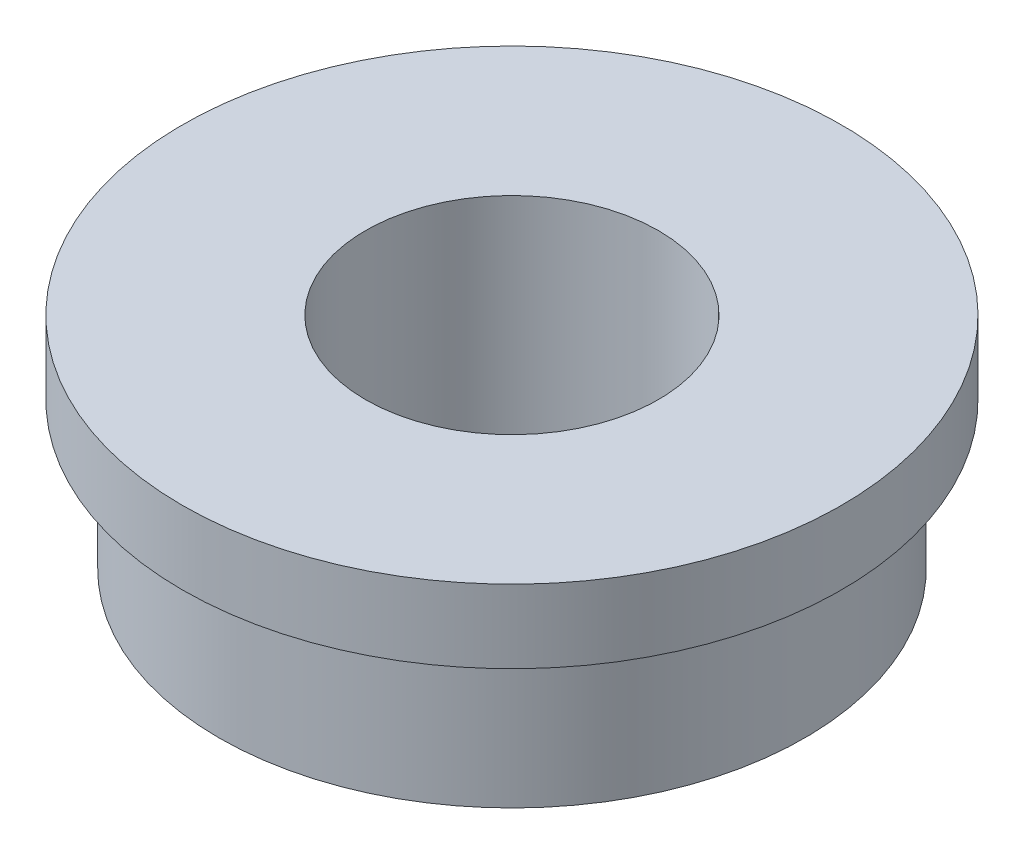
ISO-10303-21;
HEADER;
FILE_DESCRIPTION(('STEP AP214'),'2;1');
FILE_NAME('part.step','',(''),(''),'','','');
FILE_SCHEMA(('AUTOMOTIVE_DESIGN { 1 0 10303 214 1 1 1 1 }'));
ENDSEC;
DATA;
#1=APPLICATION_CONTEXT('core data for automotive mechanical design processes');
#2=APPLICATION_PROTOCOL_DEFINITION('international standard','automotive_design',2000,#1);
#3=PRODUCT_CONTEXT('',#1,'mechanical');
#4=PRODUCT('Part','Part','',(#3));
#5=PRODUCT_RELATED_PRODUCT_CATEGORY('part','',(#4));
#6=PRODUCT_DEFINITION_FORMATION('','',#4);
#7=PRODUCT_DEFINITION_CONTEXT('part definition',#1,'design');
#8=PRODUCT_DEFINITION('design','',#6,#7);
#9=PRODUCT_DEFINITION_SHAPE('','',#8);
#10=(LENGTH_UNIT() NAMED_UNIT(*) SI_UNIT(.MILLI.,.METRE.));
#11=(NAMED_UNIT(*) PLANE_ANGLE_UNIT() SI_UNIT($,.RADIAN.));
#12=(NAMED_UNIT(*) SI_UNIT($,.STERADIAN.) SOLID_ANGLE_UNIT());
#13=UNCERTAINTY_MEASURE_WITH_UNIT(LENGTH_MEASURE(1.E-05),#10,'distance_accuracy_value','');
#14=(GEOMETRIC_REPRESENTATION_CONTEXT(3) GLOBAL_UNCERTAINTY_ASSIGNED_CONTEXT((#13)) GLOBAL_UNIT_ASSIGNED_CONTEXT((#10,
#11,#12)) REPRESENTATION_CONTEXT('',''));
#15=CARTESIAN_POINT('',(0.,0.,0.));
#16=DIRECTION('',(0.,0.,1.));
#17=DIRECTION('',(1.,0.,0.));
#18=AXIS2_PLACEMENT_3D('',#15,#16,#17);
#19=CARTESIAN_POINT('',(0.,0.,0.));
#20=DIRECTION('',(0.,1.,0.));
#21=DIRECTION('',(0.,0.,1.));
#22=AXIS2_PLACEMENT_3D('',#19,#20,#21);
#23=PLANE('',#22);
#24=CARTESIAN_POINT('',(0.,0.,0.));
#25=DIRECTION('',(0.,1.,0.));
#26=DIRECTION('',(0.,0.,1.));
#27=AXIS2_PLACEMENT_3D('',#24,#25,#26);
#28=CIRCLE('',#27,4.);
#29=CARTESIAN_POINT('',(0.,0.,4.));
#30=VERTEX_POINT('',#29);
#31=EDGE_CURVE('E53',#30,#30,#28,.T.);
#32=ORIENTED_EDGE('',*,*,#31,.F.);
#33=EDGE_LOOP('',(#32));
#34=FACE_BOUND('',#33,.T.);
#35=CARTESIAN_POINT('',(0.,0.,0.));
#36=DIRECTION('',(0.,1.,0.));
#37=DIRECTION('',(0.,0.,1.));
#38=AXIS2_PLACEMENT_3D('',#35,#36,#37);
#39=CIRCLE('',#38,2.);
#40=CARTESIAN_POINT('',(0.,0.,2.));
#41=VERTEX_POINT('',#40);
#42=EDGE_CURVE('E60',#41,#41,#39,.T.);
#43=ORIENTED_EDGE('',*,*,#42,.T.);
#44=EDGE_LOOP('',(#43));
#45=FACE_BOUND('',#44,.T.);
#46=ADVANCED_FACE('F49',(#34,#45),#23,.F.);
#47=CARTESIAN_POINT('',(0.,2.,0.));
#48=DIRECTION('',(0.,-1.,0.));
#49=DIRECTION('',(0.,0.,-1.));
#50=AXIS2_PLACEMENT_3D('',#47,#48,#49);
#51=CYLINDRICAL_SURFACE('',#50,4.);
#52=CARTESIAN_POINT('',(0.,2.,0.));
#53=DIRECTION('',(0.,1.,0.));
#54=DIRECTION('',(0.,0.,1.));
#55=AXIS2_PLACEMENT_3D('',#52,#53,#54);
#56=CIRCLE('',#55,4.);
#57=CARTESIAN_POINT('',(0.,2.,4.));
#58=VERTEX_POINT('',#57);
#59=EDGE_CURVE('E11',#58,#58,#56,.T.);
#60=ORIENTED_EDGE('',*,*,#59,.F.);
#61=EDGE_LOOP('',(#60));
#62=FACE_BOUND('',#61,.T.);
#63=ORIENTED_EDGE('',*,*,#31,.T.);
#64=EDGE_LOOP('',(#63));
#65=FACE_BOUND('',#64,.T.);
#66=ADVANCED_FACE('F51',(#62,#65),#51,.T.);
#67=CARTESIAN_POINT('',(0.,2.,0.));
#68=DIRECTION('',(0.,-1.,0.));
#69=DIRECTION('',(0.,0.,-1.));
#70=AXIS2_PLACEMENT_3D('',#67,#68,#69);
#71=CYLINDRICAL_SURFACE('',#70,2.);
#72=ORIENTED_EDGE('',*,*,#42,.F.);
#73=EDGE_LOOP('',(#72));
#74=FACE_BOUND('',#73,.T.);
#75=CARTESIAN_POINT('',(0.,3.,0.));
#76=DIRECTION('',(0.,1.,0.));
#77=DIRECTION('',(0.,0.,1.));
#78=AXIS2_PLACEMENT_3D('',#75,#76,#77);
#79=CIRCLE('',#78,2.);
#80=CARTESIAN_POINT('',(0.,3.,2.));
#81=VERTEX_POINT('',#80);
#82=EDGE_CURVE('E68',#81,#81,#79,.T.);
#83=ORIENTED_EDGE('',*,*,#82,.T.);
#84=EDGE_LOOP('',(#83));
#85=FACE_BOUND('',#84,.T.);
#86=ADVANCED_FACE('F74',(#74,#85),#71,.F.);
#87=CARTESIAN_POINT('',(0.,3.,0.));
#88=DIRECTION('',(0.,1.,0.));
#89=DIRECTION('',(0.,0.,1.));
#90=AXIS2_PLACEMENT_3D('',#87,#88,#89);
#91=PLANE('',#90);
#92=CARTESIAN_POINT('',(0.,3.,0.));
#93=DIRECTION('',(0.,1.,0.));
#94=DIRECTION('',(0.,0.,1.));
#95=AXIS2_PLACEMENT_3D('',#92,#93,#94);
#96=CIRCLE('',#95,4.5);
#97=CARTESIAN_POINT('',(0.,3.,4.5));
#98=VERTEX_POINT('',#97);
#99=EDGE_CURVE('E64',#98,#98,#96,.T.);
#100=ORIENTED_EDGE('',*,*,#99,.T.);
#101=EDGE_LOOP('',(#100));
#102=FACE_BOUND('',#101,.T.);
#103=ORIENTED_EDGE('',*,*,#82,.F.);
#104=EDGE_LOOP('',(#103));
#105=FACE_BOUND('',#104,.T.);
#106=ADVANCED_FACE('F76',(#102,#105),#91,.T.);
#107=CARTESIAN_POINT('',(0.,2.,0.));
#108=DIRECTION('',(0.,1.,0.));
#109=DIRECTION('',(0.,0.,1.));
#110=AXIS2_PLACEMENT_3D('',#107,#108,#109);
#111=PLANE('',#110);
#112=ORIENTED_EDGE('',*,*,#59,.T.);
#113=EDGE_LOOP('',(#112));
#114=FACE_BOUND('',#113,.T.);
#115=CARTESIAN_POINT('',(0.,2.,0.));
#116=DIRECTION('',(0.,1.,0.));
#117=DIRECTION('',(0.,0.,1.));
#118=AXIS2_PLACEMENT_3D('',#115,#116,#117);
#119=CIRCLE('',#118,4.5);
#120=CARTESIAN_POINT('',(0.,2.,4.5));
#121=VERTEX_POINT('',#120);
#122=EDGE_CURVE('E65',#121,#121,#119,.T.);
#123=ORIENTED_EDGE('',*,*,#122,.F.);
#124=EDGE_LOOP('',(#123));
#125=FACE_BOUND('',#124,.T.);
#126=ADVANCED_FACE('F78',(#114,#125),#111,.F.);
#127=CARTESIAN_POINT('',(0.,3.,0.));
#128=DIRECTION('',(0.,-1.,0.));
#129=DIRECTION('',(0.,0.,-1.));
#130=AXIS2_PLACEMENT_3D('',#127,#128,#129);
#131=CYLINDRICAL_SURFACE('',#130,4.5);
#132=ORIENTED_EDGE('',*,*,#99,.F.);
#133=EDGE_LOOP('',(#132));
#134=FACE_BOUND('',#133,.T.);
#135=ORIENTED_EDGE('',*,*,#122,.T.);
#136=EDGE_LOOP('',(#135));
#137=FACE_BOUND('',#136,.T.);
#138=ADVANCED_FACE('F85',(#134,#137),#131,.T.);
#139=CLOSED_SHELL('',(#46,#66,#86,#106,#126,#138));
#140=MANIFOLD_SOLID_BREP('B2',#139);
#141=ADVANCED_BREP_SHAPE_REPRESENTATION('',(#18,#140),#14);
#142=SHAPE_DEFINITION_REPRESENTATION(#9,#141);
ENDSEC;
END-ISO-10303-21;
